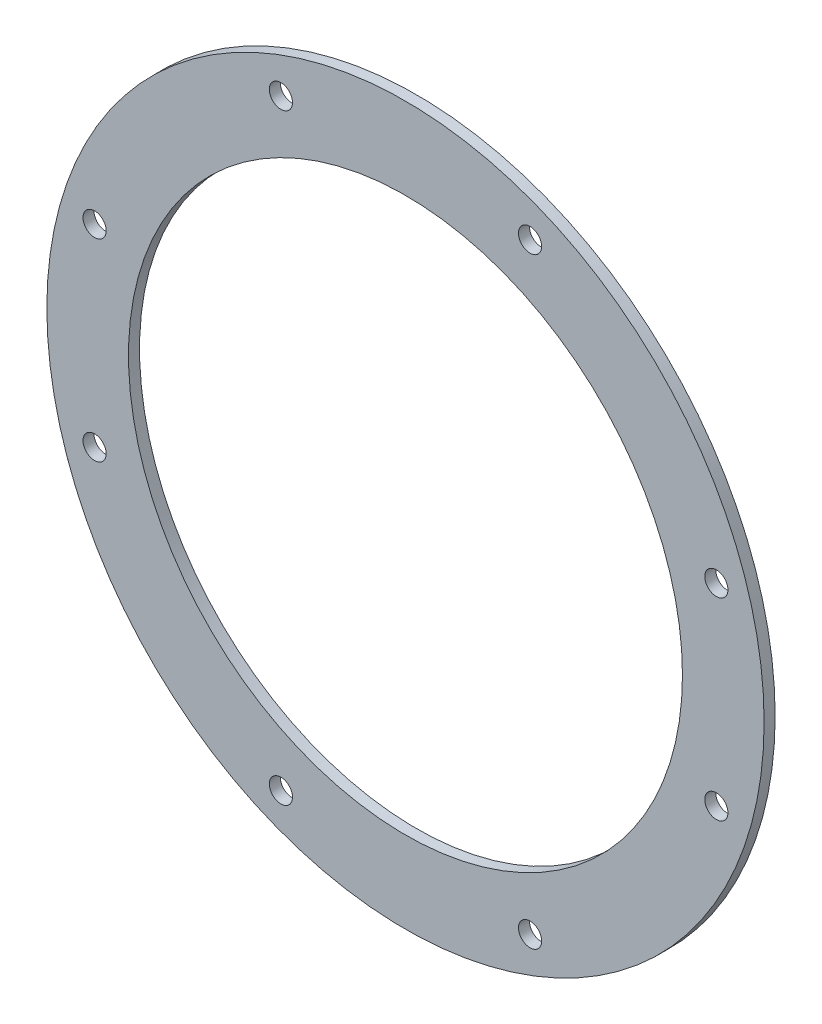
ISO-10303-21;
HEADER;
FILE_DESCRIPTION(('STEP AP214'),'2;1');
FILE_NAME('part.step','',(''),(''),'','','');
FILE_SCHEMA(('AUTOMOTIVE_DESIGN { 1 0 10303 214 1 1 1 1 }'));
ENDSEC;
DATA;
#1=APPLICATION_CONTEXT('core data for automotive mechanical design processes');
#2=APPLICATION_PROTOCOL_DEFINITION('international standard','automotive_design',2000,#1);
#3=PRODUCT_CONTEXT('',#1,'mechanical');
#4=PRODUCT('Part','Part','',(#3));
#5=PRODUCT_RELATED_PRODUCT_CATEGORY('part','',(#4));
#6=PRODUCT_DEFINITION_FORMATION('','',#4);
#7=PRODUCT_DEFINITION_CONTEXT('part definition',#1,'design');
#8=PRODUCT_DEFINITION('design','',#6,#7);
#9=PRODUCT_DEFINITION_SHAPE('','',#8);
#10=(LENGTH_UNIT() NAMED_UNIT(*) SI_UNIT(.MILLI.,.METRE.));
#11=(NAMED_UNIT(*) PLANE_ANGLE_UNIT() SI_UNIT($,.RADIAN.));
#12=(NAMED_UNIT(*) SI_UNIT($,.STERADIAN.) SOLID_ANGLE_UNIT());
#13=UNCERTAINTY_MEASURE_WITH_UNIT(LENGTH_MEASURE(1.E-05),#10,'distance_accuracy_value','');
#14=(GEOMETRIC_REPRESENTATION_CONTEXT(3) GLOBAL_UNCERTAINTY_ASSIGNED_CONTEXT((#13)) GLOBAL_UNIT_ASSIGNED_CONTEXT((#10,
#11,#12)) REPRESENTATION_CONTEXT('',''));
#15=CARTESIAN_POINT('',(0.,0.,0.));
#16=DIRECTION('',(0.,0.,1.));
#17=DIRECTION('',(1.,0.,0.));
#18=AXIS2_PLACEMENT_3D('',#15,#16,#17);
#19=CARTESIAN_POINT('',(0.,0.,2.));
#20=DIRECTION('',(0.,0.,1.));
#21=DIRECTION('',(1.,0.,0.));
#22=AXIS2_PLACEMENT_3D('',#19,#20,#21);
#23=PLANE('',#22);
#24=CARTESIAN_POINT('',(-56.3449199129788,-17.5,2.));
#25=DIRECTION('',(0.,0.,1.));
#26=DIRECTION('',(1.,0.,0.));
#27=AXIS2_PLACEMENT_3D('',#24,#25,#26);
#28=CIRCLE('',#27,2.1);
#29=CARTESIAN_POINT('',(-54.2449199129788,-17.5,2.));
#30=VERTEX_POINT('',#29);
#31=EDGE_CURVE('E85',#30,#30,#28,.T.);
#32=ORIENTED_EDGE('',*,*,#31,.F.);
#33=EDGE_LOOP('',(#32));
#34=FACE_BOUND('',#33,.T.);
#35=CARTESIAN_POINT('',(-22.5783225095399,-54.5088924181661,2.));
#36=DIRECTION('',(0.,0.,1.));
#37=DIRECTION('',(1.,0.,0.));
#38=AXIS2_PLACEMENT_3D('',#35,#36,#37);
#39=CIRCLE('',#38,2.1);
#40=CARTESIAN_POINT('',(-20.4783225095399,-54.5088924181661,2.));
#41=VERTEX_POINT('',#40);
#42=EDGE_CURVE('E73',#41,#41,#39,.T.);
#43=ORIENTED_EDGE('',*,*,#42,.F.);
#44=EDGE_LOOP('',(#43));
#45=FACE_BOUND('',#44,.T.);
#46=CARTESIAN_POINT('',(56.3449199129788,-17.5,2.));
#47=DIRECTION('',(0.,0.,1.));
#48=DIRECTION('',(1.,0.,0.));
#49=AXIS2_PLACEMENT_3D('',#46,#47,#48);
#50=CIRCLE('',#49,2.1);
#51=CARTESIAN_POINT('',(58.4449199129788,-17.5,2.));
#52=VERTEX_POINT('',#51);
#53=EDGE_CURVE('E61',#52,#52,#50,.T.);
#54=ORIENTED_EDGE('',*,*,#53,.F.);
#55=EDGE_LOOP('',(#54));
#56=FACE_BOUND('',#55,.T.);
#57=CARTESIAN_POINT('',(22.5783225095399,54.5088924181661,2.));
#58=DIRECTION('',(0.,0.,1.));
#59=DIRECTION('',(1.,0.,0.));
#60=AXIS2_PLACEMENT_3D('',#57,#58,#59);
#61=CIRCLE('',#60,2.1);
#62=CARTESIAN_POINT('',(24.6783225095399,54.5088924181661,2.));
#63=VERTEX_POINT('',#62);
#64=EDGE_CURVE('E49',#63,#63,#61,.T.);
#65=ORIENTED_EDGE('',*,*,#64,.F.);
#66=EDGE_LOOP('',(#65));
#67=FACE_BOUND('',#66,.T.);
#68=CARTESIAN_POINT('',(0.,0.,2.));
#69=DIRECTION('',(0.,0.,1.));
#70=DIRECTION('',(1.,0.,0.));
#71=AXIS2_PLACEMENT_3D('',#68,#69,#70);
#72=CIRCLE('',#71,65.);
#73=CARTESIAN_POINT('',(65.,0.,2.));
#74=VERTEX_POINT('',#73);
#75=EDGE_CURVE('E10',#74,#74,#72,.T.);
#76=ORIENTED_EDGE('',*,*,#75,.T.);
#77=EDGE_LOOP('',(#76));
#78=FACE_BOUND('',#77,.T.);
#79=CARTESIAN_POINT('',(0.,0.,2.));
#80=DIRECTION('',(0.,0.,1.));
#81=DIRECTION('',(1.,0.,0.));
#82=AXIS2_PLACEMENT_3D('',#79,#80,#81);
#83=CIRCLE('',#82,50.2);
#84=CARTESIAN_POINT('',(50.2,0.,2.));
#85=VERTEX_POINT('',#84);
#86=EDGE_CURVE('E44',#85,#85,#83,.T.);
#87=ORIENTED_EDGE('',*,*,#86,.F.);
#88=EDGE_LOOP('',(#87));
#89=FACE_BOUND('',#88,.T.);
#90=CARTESIAN_POINT('',(56.3449199129788,17.5,2.));
#91=DIRECTION('',(0.,0.,1.));
#92=DIRECTION('',(1.,0.,0.));
#93=AXIS2_PLACEMENT_3D('',#90,#91,#92);
#94=CIRCLE('',#93,2.1);
#95=CARTESIAN_POINT('',(58.4449199129788,17.5,2.));
#96=VERTEX_POINT('',#95);
#97=EDGE_CURVE('E55',#96,#96,#94,.T.);
#98=ORIENTED_EDGE('',*,*,#97,.F.);
#99=EDGE_LOOP('',(#98));
#100=FACE_BOUND('',#99,.T.);
#101=CARTESIAN_POINT('',(22.5783225095407,-54.5088924181658,2.));
#102=DIRECTION('',(0.,0.,1.));
#103=DIRECTION('',(1.,0.,0.));
#104=AXIS2_PLACEMENT_3D('',#101,#102,#103);
#105=CIRCLE('',#104,2.09999999999999);
#106=CARTESIAN_POINT('',(24.6783225095406,-54.5088924181658,2.));
#107=VERTEX_POINT('',#106);
#108=EDGE_CURVE('E67',#107,#107,#105,.T.);
#109=ORIENTED_EDGE('',*,*,#108,.F.);
#110=EDGE_LOOP('',(#109));
#111=FACE_BOUND('',#110,.T.);
#112=CARTESIAN_POINT('',(-56.3449199129788,17.5,2.));
#113=DIRECTION('',(0.,0.,1.));
#114=DIRECTION('',(1.,0.,0.));
#115=AXIS2_PLACEMENT_3D('',#112,#113,#114);
#116=CIRCLE('',#115,2.1);
#117=CARTESIAN_POINT('',(-54.2449199129788,17.5,2.));
#118=VERTEX_POINT('',#117);
#119=EDGE_CURVE('E79',#118,#118,#116,.T.);
#120=ORIENTED_EDGE('',*,*,#119,.F.);
#121=EDGE_LOOP('',(#120));
#122=FACE_BOUND('',#121,.T.);
#123=CARTESIAN_POINT('',(-22.5783225095407,54.5088924181658,2.));
#124=DIRECTION('',(0.,0.,1.));
#125=DIRECTION('',(1.,0.,0.));
#126=AXIS2_PLACEMENT_3D('',#123,#124,#125);
#127=CIRCLE('',#126,2.09999999999999);
#128=CARTESIAN_POINT('',(-20.4783225095407,54.5088924181658,2.));
#129=VERTEX_POINT('',#128);
#130=EDGE_CURVE('E91',#129,#129,#127,.T.);
#131=ORIENTED_EDGE('',*,*,#130,.F.);
#132=EDGE_LOOP('',(#131));
#133=FACE_BOUND('',#132,.T.);
#134=ADVANCED_FACE('F33',(#34,#45,#56,#67,#78,#89,#100,#111,#122,#133),#23,.T.);
#135=CARTESIAN_POINT('',(0.,0.,0.));
#136=DIRECTION('',(0.,0.,1.));
#137=DIRECTION('',(1.,0.,0.));
#138=AXIS2_PLACEMENT_3D('',#135,#136,#137);
#139=PLANE('',#138);
#140=CARTESIAN_POINT('',(0.,0.,0.));
#141=DIRECTION('',(0.,0.,1.));
#142=DIRECTION('',(1.,0.,0.));
#143=AXIS2_PLACEMENT_3D('',#140,#141,#142);
#144=CIRCLE('',#143,65.);
#145=CARTESIAN_POINT('',(65.,0.,0.));
#146=VERTEX_POINT('',#145);
#147=EDGE_CURVE('E37',#146,#146,#144,.T.);
#148=ORIENTED_EDGE('',*,*,#147,.F.);
#149=EDGE_LOOP('',(#148));
#150=FACE_BOUND('',#149,.T.);
#151=CARTESIAN_POINT('',(0.,0.,0.));
#152=DIRECTION('',(0.,0.,1.));
#153=DIRECTION('',(1.,0.,0.));
#154=AXIS2_PLACEMENT_3D('',#151,#152,#153);
#155=CIRCLE('',#154,50.2);
#156=CARTESIAN_POINT('',(50.2,0.,0.));
#157=VERTEX_POINT('',#156);
#158=EDGE_CURVE('E46',#157,#157,#155,.T.);
#159=ORIENTED_EDGE('',*,*,#158,.T.);
#160=EDGE_LOOP('',(#159));
#161=FACE_BOUND('',#160,.T.);
#162=CARTESIAN_POINT('',(22.5783225095399,54.5088924181661,0.));
#163=DIRECTION('',(0.,0.,1.));
#164=DIRECTION('',(1.,0.,0.));
#165=AXIS2_PLACEMENT_3D('',#162,#163,#164);
#166=CIRCLE('',#165,2.1);
#167=CARTESIAN_POINT('',(24.6783225095399,54.5088924181661,0.));
#168=VERTEX_POINT('',#167);
#169=EDGE_CURVE('E52',#168,#168,#166,.T.);
#170=ORIENTED_EDGE('',*,*,#169,.T.);
#171=EDGE_LOOP('',(#170));
#172=FACE_BOUND('',#171,.T.);
#173=CARTESIAN_POINT('',(56.3449199129788,17.5,0.));
#174=DIRECTION('',(0.,0.,1.));
#175=DIRECTION('',(1.,0.,0.));
#176=AXIS2_PLACEMENT_3D('',#173,#174,#175);
#177=CIRCLE('',#176,2.1);
#178=CARTESIAN_POINT('',(58.4449199129788,17.5,0.));
#179=VERTEX_POINT('',#178);
#180=EDGE_CURVE('E58',#179,#179,#177,.T.);
#181=ORIENTED_EDGE('',*,*,#180,.T.);
#182=EDGE_LOOP('',(#181));
#183=FACE_BOUND('',#182,.T.);
#184=CARTESIAN_POINT('',(56.3449199129788,-17.5,0.));
#185=DIRECTION('',(0.,0.,1.));
#186=DIRECTION('',(1.,0.,0.));
#187=AXIS2_PLACEMENT_3D('',#184,#185,#186);
#188=CIRCLE('',#187,2.1);
#189=CARTESIAN_POINT('',(58.4449199129788,-17.5,0.));
#190=VERTEX_POINT('',#189);
#191=EDGE_CURVE('E64',#190,#190,#188,.T.);
#192=ORIENTED_EDGE('',*,*,#191,.T.);
#193=EDGE_LOOP('',(#192));
#194=FACE_BOUND('',#193,.T.);
#195=CARTESIAN_POINT('',(22.5783225095407,-54.5088924181658,0.));
#196=DIRECTION('',(0.,0.,1.));
#197=DIRECTION('',(1.,0.,0.));
#198=AXIS2_PLACEMENT_3D('',#195,#196,#197);
#199=CIRCLE('',#198,2.09999999999999);
#200=CARTESIAN_POINT('',(24.6783225095406,-54.5088924181658,0.));
#201=VERTEX_POINT('',#200);
#202=EDGE_CURVE('E70',#201,#201,#199,.T.);
#203=ORIENTED_EDGE('',*,*,#202,.T.);
#204=EDGE_LOOP('',(#203));
#205=FACE_BOUND('',#204,.T.);
#206=CARTESIAN_POINT('',(-22.5783225095399,-54.5088924181661,0.));
#207=DIRECTION('',(0.,0.,1.));
#208=DIRECTION('',(1.,0.,0.));
#209=AXIS2_PLACEMENT_3D('',#206,#207,#208);
#210=CIRCLE('',#209,2.1);
#211=CARTESIAN_POINT('',(-20.4783225095399,-54.5088924181661,0.));
#212=VERTEX_POINT('',#211);
#213=EDGE_CURVE('E76',#212,#212,#210,.T.);
#214=ORIENTED_EDGE('',*,*,#213,.T.);
#215=EDGE_LOOP('',(#214));
#216=FACE_BOUND('',#215,.T.);
#217=CARTESIAN_POINT('',(-56.3449199129788,17.5,0.));
#218=DIRECTION('',(0.,0.,1.));
#219=DIRECTION('',(1.,0.,0.));
#220=AXIS2_PLACEMENT_3D('',#217,#218,#219);
#221=CIRCLE('',#220,2.1);
#222=CARTESIAN_POINT('',(-54.2449199129788,17.5,0.));
#223=VERTEX_POINT('',#222);
#224=EDGE_CURVE('E82',#223,#223,#221,.T.);
#225=ORIENTED_EDGE('',*,*,#224,.T.);
#226=EDGE_LOOP('',(#225));
#227=FACE_BOUND('',#226,.T.);
#228=CARTESIAN_POINT('',(-56.3449199129788,-17.5,0.));
#229=DIRECTION('',(0.,0.,1.));
#230=DIRECTION('',(1.,0.,0.));
#231=AXIS2_PLACEMENT_3D('',#228,#229,#230);
#232=CIRCLE('',#231,2.1);
#233=CARTESIAN_POINT('',(-54.2449199129788,-17.5,0.));
#234=VERTEX_POINT('',#233);
#235=EDGE_CURVE('E88',#234,#234,#232,.T.);
#236=ORIENTED_EDGE('',*,*,#235,.T.);
#237=EDGE_LOOP('',(#236));
#238=FACE_BOUND('',#237,.T.);
#239=CARTESIAN_POINT('',(-22.5783225095407,54.5088924181658,0.));
#240=DIRECTION('',(0.,0.,1.));
#241=DIRECTION('',(1.,0.,0.));
#242=AXIS2_PLACEMENT_3D('',#239,#240,#241);
#243=CIRCLE('',#242,2.09999999999999);
#244=CARTESIAN_POINT('',(-20.4783225095407,54.5088924181658,0.));
#245=VERTEX_POINT('',#244);
#246=EDGE_CURVE('E94',#245,#245,#243,.T.);
#247=ORIENTED_EDGE('',*,*,#246,.T.);
#248=EDGE_LOOP('',(#247));
#249=FACE_BOUND('',#248,.T.);
#250=ADVANCED_FACE('F104',(#150,#161,#172,#183,#194,#205,#216,#227,#238,#249),#139,.F.);
#251=CARTESIAN_POINT('',(0.,0.,2.));
#252=DIRECTION('',(0.,0.,-1.));
#253=DIRECTION('',(-1.,0.,0.));
#254=AXIS2_PLACEMENT_3D('',#251,#252,#253);
#255=CYLINDRICAL_SURFACE('',#254,65.);
#256=ORIENTED_EDGE('',*,*,#75,.F.);
#257=EDGE_LOOP('',(#256));
#258=FACE_BOUND('',#257,.T.);
#259=ORIENTED_EDGE('',*,*,#147,.T.);
#260=EDGE_LOOP('',(#259));
#261=FACE_BOUND('',#260,.T.);
#262=ADVANCED_FACE('F35',(#258,#261),#255,.T.);
#263=CARTESIAN_POINT('',(0.,0.,2.));
#264=DIRECTION('',(0.,0.,-1.));
#265=DIRECTION('',(-1.,0.,0.));
#266=AXIS2_PLACEMENT_3D('',#263,#264,#265);
#267=CYLINDRICAL_SURFACE('',#266,50.2);
#268=ORIENTED_EDGE('',*,*,#86,.T.);
#269=EDGE_LOOP('',(#268));
#270=FACE_BOUND('',#269,.T.);
#271=ORIENTED_EDGE('',*,*,#158,.F.);
#272=EDGE_LOOP('',(#271));
#273=FACE_BOUND('',#272,.T.);
#274=ADVANCED_FACE('F114',(#270,#273),#267,.F.);
#275=CARTESIAN_POINT('',(22.5783225095399,54.5088924181661,2.));
#276=DIRECTION('',(0.,0.,-1.));
#277=DIRECTION('',(-1.,0.,0.));
#278=AXIS2_PLACEMENT_3D('',#275,#276,#277);
#279=CYLINDRICAL_SURFACE('',#278,2.1);
#280=ORIENTED_EDGE('',*,*,#64,.T.);
#281=EDGE_LOOP('',(#280));
#282=FACE_BOUND('',#281,.T.);
#283=ORIENTED_EDGE('',*,*,#169,.F.);
#284=EDGE_LOOP('',(#283));
#285=FACE_BOUND('',#284,.T.);
#286=ADVANCED_FACE('F117',(#282,#285),#279,.F.);
#287=CARTESIAN_POINT('',(56.3449199129788,17.5,2.));
#288=DIRECTION('',(0.,0.,-1.));
#289=DIRECTION('',(-1.,0.,0.));
#290=AXIS2_PLACEMENT_3D('',#287,#288,#289);
#291=CYLINDRICAL_SURFACE('',#290,2.1);
#292=ORIENTED_EDGE('',*,*,#97,.T.);
#293=EDGE_LOOP('',(#292));
#294=FACE_BOUND('',#293,.T.);
#295=ORIENTED_EDGE('',*,*,#180,.F.);
#296=EDGE_LOOP('',(#295));
#297=FACE_BOUND('',#296,.T.);
#298=ADVANCED_FACE('F121',(#294,#297),#291,.F.);
#299=CARTESIAN_POINT('',(56.3449199129788,-17.5,2.));
#300=DIRECTION('',(0.,0.,-1.));
#301=DIRECTION('',(-1.,0.,0.));
#302=AXIS2_PLACEMENT_3D('',#299,#300,#301);
#303=CYLINDRICAL_SURFACE('',#302,2.1);
#304=ORIENTED_EDGE('',*,*,#53,.T.);
#305=EDGE_LOOP('',(#304));
#306=FACE_BOUND('',#305,.T.);
#307=ORIENTED_EDGE('',*,*,#191,.F.);
#308=EDGE_LOOP('',(#307));
#309=FACE_BOUND('',#308,.T.);
#310=ADVANCED_FACE('F125',(#306,#309),#303,.F.);
#311=CARTESIAN_POINT('',(22.5783225095407,-54.5088924181658,2.));
#312=DIRECTION('',(0.,0.,-1.));
#313=DIRECTION('',(-1.,0.,0.));
#314=AXIS2_PLACEMENT_3D('',#311,#312,#313);
#315=CYLINDRICAL_SURFACE('',#314,2.09999999999999);
#316=ORIENTED_EDGE('',*,*,#108,.T.);
#317=EDGE_LOOP('',(#316));
#318=FACE_BOUND('',#317,.T.);
#319=ORIENTED_EDGE('',*,*,#202,.F.);
#320=EDGE_LOOP('',(#319));
#321=FACE_BOUND('',#320,.T.);
#322=ADVANCED_FACE('F129',(#318,#321),#315,.F.);
#323=CARTESIAN_POINT('',(-22.5783225095399,-54.5088924181661,2.));
#324=DIRECTION('',(0.,0.,-1.));
#325=DIRECTION('',(-1.,0.,0.));
#326=AXIS2_PLACEMENT_3D('',#323,#324,#325);
#327=CYLINDRICAL_SURFACE('',#326,2.1);
#328=ORIENTED_EDGE('',*,*,#42,.T.);
#329=EDGE_LOOP('',(#328));
#330=FACE_BOUND('',#329,.T.);
#331=ORIENTED_EDGE('',*,*,#213,.F.);
#332=EDGE_LOOP('',(#331));
#333=FACE_BOUND('',#332,.T.);
#334=ADVANCED_FACE('F133',(#330,#333),#327,.F.);
#335=CARTESIAN_POINT('',(-56.3449199129788,17.5,2.));
#336=DIRECTION('',(0.,0.,-1.));
#337=DIRECTION('',(-1.,0.,0.));
#338=AXIS2_PLACEMENT_3D('',#335,#336,#337);
#339=CYLINDRICAL_SURFACE('',#338,2.1);
#340=ORIENTED_EDGE('',*,*,#119,.T.);
#341=EDGE_LOOP('',(#340));
#342=FACE_BOUND('',#341,.T.);
#343=ORIENTED_EDGE('',*,*,#224,.F.);
#344=EDGE_LOOP('',(#343));
#345=FACE_BOUND('',#344,.T.);
#346=ADVANCED_FACE('F137',(#342,#345),#339,.F.);
#347=CARTESIAN_POINT('',(-56.3449199129788,-17.5,2.));
#348=DIRECTION('',(0.,0.,-1.));
#349=DIRECTION('',(-1.,0.,0.));
#350=AXIS2_PLACEMENT_3D('',#347,#348,#349);
#351=CYLINDRICAL_SURFACE('',#350,2.1);
#352=ORIENTED_EDGE('',*,*,#31,.T.);
#353=EDGE_LOOP('',(#352));
#354=FACE_BOUND('',#353,.T.);
#355=ORIENTED_EDGE('',*,*,#235,.F.);
#356=EDGE_LOOP('',(#355));
#357=FACE_BOUND('',#356,.T.);
#358=ADVANCED_FACE('F141',(#354,#357),#351,.F.);
#359=CARTESIAN_POINT('',(-22.5783225095407,54.5088924181658,2.));
#360=DIRECTION('',(0.,0.,-1.));
#361=DIRECTION('',(-1.,0.,0.));
#362=AXIS2_PLACEMENT_3D('',#359,#360,#361);
#363=CYLINDRICAL_SURFACE('',#362,2.09999999999999);
#364=ORIENTED_EDGE('',*,*,#130,.T.);
#365=EDGE_LOOP('',(#364));
#366=FACE_BOUND('',#365,.T.);
#367=ORIENTED_EDGE('',*,*,#246,.F.);
#368=EDGE_LOOP('',(#367));
#369=FACE_BOUND('',#368,.T.);
#370=ADVANCED_FACE('F100',(#366,#369),#363,.F.);
#371=CLOSED_SHELL('',(#134,#250,#262,#274,#286,#298,#310,#322,#334,#346,#358,#370));
#372=MANIFOLD_SOLID_BREP('B2',#371);
#373=ADVANCED_BREP_SHAPE_REPRESENTATION('',(#18,#372),#14);
#374=SHAPE_DEFINITION_REPRESENTATION(#9,#373);
ENDSEC;
END-ISO-10303-21;
